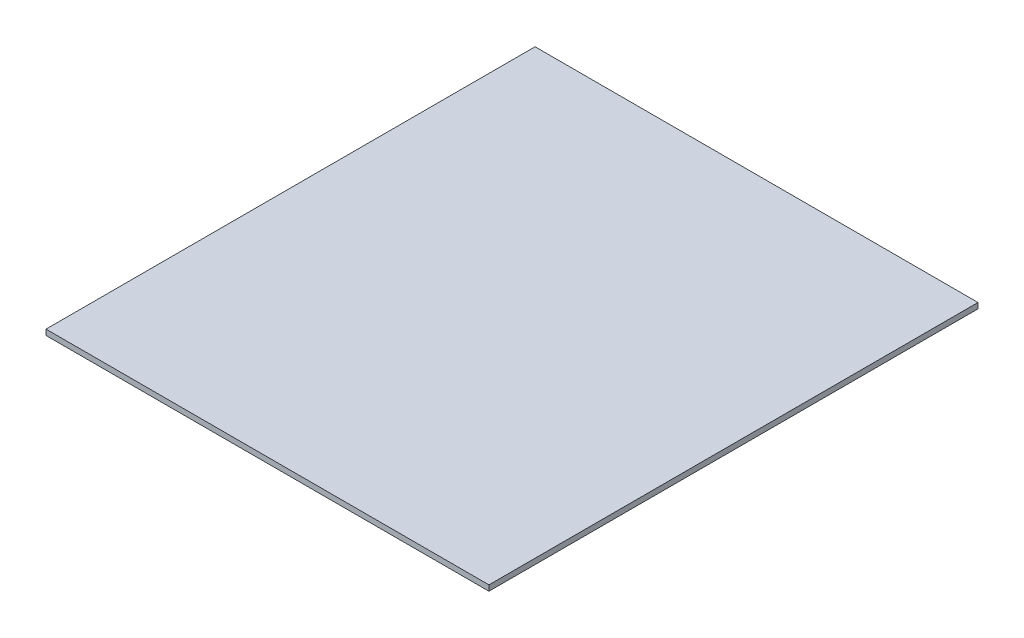
ISO-10303-21;
HEADER;
FILE_DESCRIPTION(('STEP AP214'),'2;1');
FILE_NAME('part.step','',(''),(''),'','','');
FILE_SCHEMA(('AUTOMOTIVE_DESIGN { 1 0 10303 214 1 1 1 1 }'));
ENDSEC;
DATA;
#1=APPLICATION_CONTEXT('core data for automotive mechanical design processes');
#2=APPLICATION_PROTOCOL_DEFINITION('international standard','automotive_design',2000,#1);
#3=PRODUCT_CONTEXT('',#1,'mechanical');
#4=PRODUCT('Part','Part','',(#3));
#5=PRODUCT_RELATED_PRODUCT_CATEGORY('part','',(#4));
#6=PRODUCT_DEFINITION_FORMATION('','',#4);
#7=PRODUCT_DEFINITION_CONTEXT('part definition',#1,'design');
#8=PRODUCT_DEFINITION('design','',#6,#7);
#9=PRODUCT_DEFINITION_SHAPE('','',#8);
#10=(LENGTH_UNIT() NAMED_UNIT(*) SI_UNIT(.MILLI.,.METRE.));
#11=(NAMED_UNIT(*) PLANE_ANGLE_UNIT() SI_UNIT($,.RADIAN.));
#12=(NAMED_UNIT(*) SI_UNIT($,.STERADIAN.) SOLID_ANGLE_UNIT());
#13=UNCERTAINTY_MEASURE_WITH_UNIT(LENGTH_MEASURE(1.E-05),#10,'distance_accuracy_value','');
#14=(GEOMETRIC_REPRESENTATION_CONTEXT(3) GLOBAL_UNCERTAINTY_ASSIGNED_CONTEXT((#13)) GLOBAL_UNIT_ASSIGNED_CONTEXT((#10,
#11,#12)) REPRESENTATION_CONTEXT('',''));
#15=CARTESIAN_POINT('',(0.,0.,0.));
#16=DIRECTION('',(0.,0.,1.));
#17=DIRECTION('',(1.,0.,0.));
#18=AXIS2_PLACEMENT_3D('',#15,#16,#17);
#19=CARTESIAN_POINT('',(240.,6.,265.));
#20=DIRECTION('',(-1.,0.,0.));
#21=DIRECTION('',(0.,0.,1.));
#22=AXIS2_PLACEMENT_3D('',#19,#20,#21);
#23=PLANE('',#22);
#24=DIRECTION('',(0.,0.,-1.));
#25=VECTOR('',#24,1.);
#26=CARTESIAN_POINT('',(240.,0.,265.));
#27=LINE('',#26,#25);
#28=CARTESIAN_POINT('',(240.,0.,265.));
#29=VERTEX_POINT('',#28);
#30=CARTESIAN_POINT('',(240.,0.,-265.));
#31=VERTEX_POINT('',#30);
#32=EDGE_CURVE('E80',#29,#31,#27,.T.);
#33=ORIENTED_EDGE('',*,*,#32,.T.);
#34=DIRECTION('',(0.,-1.,0.));
#35=VECTOR('',#34,1.);
#36=CARTESIAN_POINT('',(240.,6.,-265.));
#37=LINE('',#36,#35);
#38=CARTESIAN_POINT('',(240.,6.,-265.));
#39=VERTEX_POINT('',#38);
#40=EDGE_CURVE('E11',#39,#31,#37,.T.);
#41=ORIENTED_EDGE('',*,*,#40,.F.);
#42=DIRECTION('',(0.,0.,-1.));
#43=VECTOR('',#42,1.);
#44=CARTESIAN_POINT('',(240.,6.,265.));
#45=LINE('',#44,#43);
#46=CARTESIAN_POINT('',(240.,6.,265.));
#47=VERTEX_POINT('',#46);
#48=EDGE_CURVE('E68',#47,#39,#45,.T.);
#49=ORIENTED_EDGE('',*,*,#48,.F.);
#50=DIRECTION('',(0.,-1.,0.));
#51=VECTOR('',#50,1.);
#52=CARTESIAN_POINT('',(240.,6.,265.));
#53=LINE('',#52,#51);
#54=EDGE_CURVE('E76',#47,#29,#53,.T.);
#55=ORIENTED_EDGE('',*,*,#54,.T.);
#56=EDGE_LOOP('',(#33,#41,#49,#55));
#57=FACE_BOUND('',#56,.T.);
#58=ADVANCED_FACE('F17',(#57),#23,.F.);
#59=CARTESIAN_POINT('',(-240.,6.,-265.));
#60=DIRECTION('',(0.,0.,1.));
#61=DIRECTION('',(1.,0.,0.));
#62=AXIS2_PLACEMENT_3D('',#59,#60,#61);
#63=PLANE('',#62);
#64=DIRECTION('',(-1.,0.,0.));
#65=VECTOR('',#64,1.);
#66=CARTESIAN_POINT('',(-240.,0.,-265.));
#67=LINE('',#66,#65);
#68=CARTESIAN_POINT('',(-240.,0.,-265.));
#69=VERTEX_POINT('',#68);
#70=EDGE_CURVE('E72',#31,#69,#67,.T.);
#71=ORIENTED_EDGE('',*,*,#70,.T.);
#72=DIRECTION('',(0.,-1.,0.));
#73=VECTOR('',#72,1.);
#74=CARTESIAN_POINT('',(-240.,6.,-265.));
#75=LINE('',#74,#73);
#76=CARTESIAN_POINT('',(-240.,6.,-265.));
#77=VERTEX_POINT('',#76);
#78=EDGE_CURVE('E25',#77,#69,#75,.T.);
#79=ORIENTED_EDGE('',*,*,#78,.F.);
#80=DIRECTION('',(-1.,0.,0.));
#81=VECTOR('',#80,1.);
#82=CARTESIAN_POINT('',(-240.,6.,-265.));
#83=LINE('',#82,#81);
#84=EDGE_CURVE('E63',#39,#77,#83,.T.);
#85=ORIENTED_EDGE('',*,*,#84,.F.);
#86=ORIENTED_EDGE('',*,*,#40,.T.);
#87=EDGE_LOOP('',(#71,#79,#85,#86));
#88=FACE_BOUND('',#87,.T.);
#89=ADVANCED_FACE('F71',(#88),#63,.F.);
#90=CARTESIAN_POINT('',(-240.,6.,265.));
#91=DIRECTION('',(1.,0.,0.));
#92=DIRECTION('',(0.,0.,-1.));
#93=AXIS2_PLACEMENT_3D('',#90,#91,#92);
#94=PLANE('',#93);
#95=DIRECTION('',(0.,0.,1.));
#96=VECTOR('',#95,1.);
#97=CARTESIAN_POINT('',(-240.,0.,265.));
#98=LINE('',#97,#96);
#99=CARTESIAN_POINT('',(-240.,0.,265.));
#100=VERTEX_POINT('',#99);
#101=EDGE_CURVE('E50',#69,#100,#98,.T.);
#102=ORIENTED_EDGE('',*,*,#101,.T.);
#103=DIRECTION('',(0.,-1.,0.));
#104=VECTOR('',#103,1.);
#105=CARTESIAN_POINT('',(-240.,6.,265.));
#106=LINE('',#105,#104);
#107=CARTESIAN_POINT('',(-240.,6.,265.));
#108=VERTEX_POINT('',#107);
#109=EDGE_CURVE('E73',#108,#100,#106,.T.);
#110=ORIENTED_EDGE('',*,*,#109,.F.);
#111=DIRECTION('',(0.,0.,1.));
#112=VECTOR('',#111,1.);
#113=CARTESIAN_POINT('',(-240.,6.,265.));
#114=LINE('',#113,#112);
#115=EDGE_CURVE('E66',#77,#108,#114,.T.);
#116=ORIENTED_EDGE('',*,*,#115,.F.);
#117=ORIENTED_EDGE('',*,*,#78,.T.);
#118=EDGE_LOOP('',(#102,#110,#116,#117));
#119=FACE_BOUND('',#118,.T.);
#120=ADVANCED_FACE('F74',(#119),#94,.F.);
#121=CARTESIAN_POINT('',(-240.,6.,265.));
#122=DIRECTION('',(0.,0.,-1.));
#123=DIRECTION('',(-1.,0.,0.));
#124=AXIS2_PLACEMENT_3D('',#121,#122,#123);
#125=PLANE('',#124);
#126=DIRECTION('',(1.,0.,0.));
#127=VECTOR('',#126,1.);
#128=CARTESIAN_POINT('',(-240.,0.,265.));
#129=LINE('',#128,#127);
#130=EDGE_CURVE('E56',#100,#29,#129,.T.);
#131=ORIENTED_EDGE('',*,*,#130,.T.);
#132=ORIENTED_EDGE('',*,*,#54,.F.);
#133=DIRECTION('',(1.,0.,0.));
#134=VECTOR('',#133,1.);
#135=CARTESIAN_POINT('',(-240.,6.,265.));
#136=LINE('',#135,#134);
#137=EDGE_CURVE('E33',#108,#47,#136,.T.);
#138=ORIENTED_EDGE('',*,*,#137,.F.);
#139=ORIENTED_EDGE('',*,*,#109,.T.);
#140=EDGE_LOOP('',(#131,#132,#138,#139));
#141=FACE_BOUND('',#140,.T.);
#142=ADVANCED_FACE('F87',(#141),#125,.F.);
#143=CARTESIAN_POINT('',(0.,6.,0.));
#144=DIRECTION('',(0.,-1.,0.));
#145=DIRECTION('',(0.,0.,-1.));
#146=AXIS2_PLACEMENT_3D('',#143,#144,#145);
#147=PLANE('',#146);
#148=ORIENTED_EDGE('',*,*,#48,.T.);
#149=ORIENTED_EDGE('',*,*,#84,.T.);
#150=ORIENTED_EDGE('',*,*,#115,.T.);
#151=ORIENTED_EDGE('',*,*,#137,.T.);
#152=EDGE_LOOP('',(#148,#149,#150,#151));
#153=FACE_BOUND('',#152,.T.);
#154=ADVANCED_FACE('F64',(#153),#147,.F.);
#155=CARTESIAN_POINT('',(0.,0.,0.));
#156=DIRECTION('',(0.,-1.,0.));
#157=DIRECTION('',(0.,0.,-1.));
#158=AXIS2_PLACEMENT_3D('',#155,#156,#157);
#159=PLANE('',#158);
#160=ORIENTED_EDGE('',*,*,#32,.F.);
#161=ORIENTED_EDGE('',*,*,#130,.F.);
#162=ORIENTED_EDGE('',*,*,#101,.F.);
#163=ORIENTED_EDGE('',*,*,#70,.F.);
#164=EDGE_LOOP('',(#160,#161,#162,#163));
#165=FACE_BOUND('',#164,.T.);
#166=ADVANCED_FACE('F90',(#165),#159,.T.);
#167=CLOSED_SHELL('',(#58,#89,#120,#142,#154,#166));
#168=MANIFOLD_SOLID_BREP('B1',#167);
#169=ADVANCED_BREP_SHAPE_REPRESENTATION('',(#18,#168),#14);
#170=SHAPE_DEFINITION_REPRESENTATION(#9,#169);
ENDSEC;
END-ISO-10303-21;
